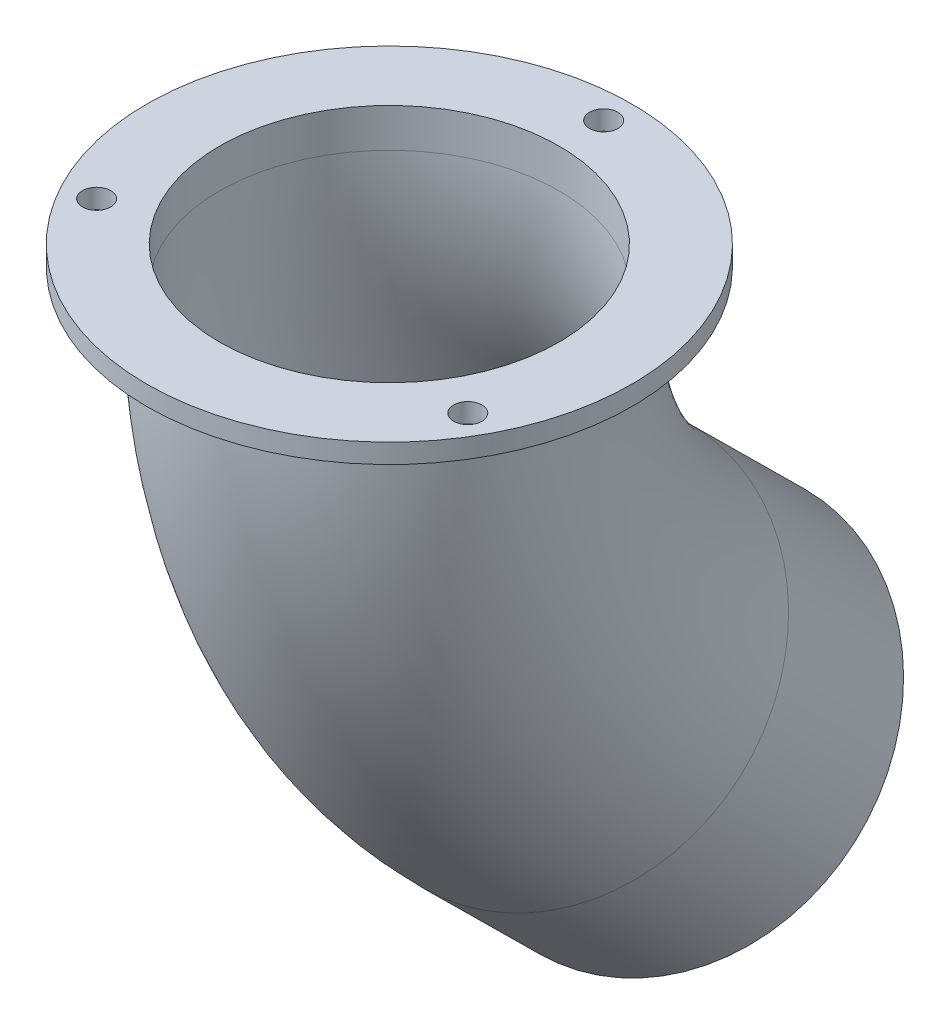
ISO-10303-21;
HEADER;
FILE_DESCRIPTION(('STEP AP214'),'2;1');
FILE_NAME('part.step','',(''),(''),'','','');
FILE_SCHEMA(('AUTOMOTIVE_DESIGN { 1 0 10303 214 1 1 1 1 }'));
ENDSEC;
DATA;
#1=APPLICATION_CONTEXT('core data for automotive mechanical design processes');
#2=APPLICATION_PROTOCOL_DEFINITION('international standard','automotive_design',2000,#1);
#3=PRODUCT_CONTEXT('',#1,'mechanical');
#4=PRODUCT('Part','Part','',(#3));
#5=PRODUCT_RELATED_PRODUCT_CATEGORY('part','',(#4));
#6=PRODUCT_DEFINITION_FORMATION('','',#4);
#7=PRODUCT_DEFINITION_CONTEXT('part definition',#1,'design');
#8=PRODUCT_DEFINITION('design','',#6,#7);
#9=PRODUCT_DEFINITION_SHAPE('','',#8);
#10=(LENGTH_UNIT() NAMED_UNIT(*) SI_UNIT(.MILLI.,.METRE.));
#11=(NAMED_UNIT(*) PLANE_ANGLE_UNIT() SI_UNIT($,.RADIAN.));
#12=(NAMED_UNIT(*) SI_UNIT($,.STERADIAN.) SOLID_ANGLE_UNIT());
#13=UNCERTAINTY_MEASURE_WITH_UNIT(LENGTH_MEASURE(1.E-05),#10,'distance_accuracy_value','');
#14=(GEOMETRIC_REPRESENTATION_CONTEXT(3) GLOBAL_UNCERTAINTY_ASSIGNED_CONTEXT((#13)) GLOBAL_UNIT_ASSIGNED_CONTEXT((#10,
#11,#12)) REPRESENTATION_CONTEXT('',''));
#15=CARTESIAN_POINT('',(0.,0.,0.));
#16=DIRECTION('',(0.,0.,1.));
#17=DIRECTION('',(1.,0.,0.));
#18=AXIS2_PLACEMENT_3D('',#15,#16,#17);
#19=CARTESIAN_POINT('',(0.,-52.1551744018365,-20.7615737432355));
#20=DIRECTION('',(0.,-0.70340608938235,-0.710788205740521));
#21=DIRECTION('',(0.,0.710788205740521,-0.70340608938235));
#22=AXIS2_PLACEMENT_3D('',#19,#20,#21);
#23=CYLINDRICAL_SURFACE('',#22,23.4);
#24=CARTESIAN_POINT('',(0.,-52.1551744018365,-20.7615737432355));
#25=DIRECTION('',(0.,0.703406089382349,0.710788205740522));
#26=DIRECTION('',(0.,-0.710788205740522,0.703406089382349));
#27=AXIS2_PLACEMENT_3D('',#24,#25,#26);
#28=CIRCLE('',#27,23.4);
#29=CARTESIAN_POINT('',(0.,-68.7876184161647,-4.30187125168854));
#30=VERTEX_POINT('',#29);
#31=EDGE_CURVE('E40',#30,#30,#28,.T.);
#32=ORIENTED_EDGE('',*,*,#31,.F.);
#33=EDGE_LOOP('',(#32));
#34=FACE_BOUND('',#33,.T.);
#35=CARTESIAN_POINT('',(0.,-66.2232961894835,-34.9773378580459));
#36=DIRECTION('',(0.,0.703406089382349,0.710788205740522));
#37=DIRECTION('',(0.,-0.710788205740522,0.703406089382349));
#38=AXIS2_PLACEMENT_3D('',#35,#36,#37);
#39=CIRCLE('',#38,23.4);
#40=CARTESIAN_POINT('',(0.,-82.8557402038117,-18.517635366499));
#41=VERTEX_POINT('',#40);
#42=EDGE_CURVE('E10',#41,#41,#39,.T.);
#43=ORIENTED_EDGE('',*,*,#42,.T.);
#44=EDGE_LOOP('',(#43));
#45=FACE_BOUND('',#44,.T.);
#46=ADVANCED_FACE('F30',(#34,#45),#23,.T.);
#47=CARTESIAN_POINT('',(0.,-52.1551744018365,-20.7615737432355));
#48=DIRECTION('',(0.,-0.70340608938235,-0.710788205740521));
#49=DIRECTION('',(0.,0.710788205740521,-0.70340608938235));
#50=AXIS2_PLACEMENT_3D('',#47,#48,#49);
#51=CYLINDRICAL_SURFACE('',#50,21.);
#52=CARTESIAN_POINT('',(0.,-52.1551744018365,-20.7615737432355));
#53=DIRECTION('',(0.,0.703406089382349,0.710788205740522));
#54=DIRECTION('',(0.,-0.710788205740522,0.703406089382349));
#55=AXIS2_PLACEMENT_3D('',#52,#53,#54);
#56=CIRCLE('',#55,21.);
#57=CARTESIAN_POINT('',(0.,-67.0817267223875,-5.99004586620619));
#58=VERTEX_POINT('',#57);
#59=EDGE_CURVE('E44',#58,#58,#56,.T.);
#60=ORIENTED_EDGE('',*,*,#59,.T.);
#61=EDGE_LOOP('',(#60));
#62=FACE_BOUND('',#61,.T.);
#63=CARTESIAN_POINT('',(0.,-66.2232961894835,-34.9773378580459));
#64=DIRECTION('',(0.,0.703406089382349,0.710788205740522));
#65=DIRECTION('',(0.,-0.710788205740522,0.703406089382349));
#66=AXIS2_PLACEMENT_3D('',#63,#64,#65);
#67=CIRCLE('',#66,21.);
#68=CARTESIAN_POINT('',(0.,-81.1498485100344,-20.2058099810166));
#69=VERTEX_POINT('',#68);
#70=EDGE_CURVE('E36',#69,#69,#67,.T.);
#71=ORIENTED_EDGE('',*,*,#70,.F.);
#72=EDGE_LOOP('',(#71));
#73=FACE_BOUND('',#72,.T.);
#74=ADVANCED_FACE('F108',(#62,#73),#51,.F.);
#75=CARTESIAN_POINT('',(0.,-2.4,-70.));
#76=DIRECTION('',(1.,0.,0.));
#77=DIRECTION('',(0.,0.,-1.));
#78=AXIS2_PLACEMENT_3D('',#75,#76,#77);
#79=TOROIDAL_SURFACE('',#78,70.,23.4);
#80=CARTESIAN_POINT('',(0.,-2.4,0.));
#81=DIRECTION('',(0.,1.,0.));
#82=DIRECTION('',(0.,0.,1.));
#83=AXIS2_PLACEMENT_3D('',#80,#81,#82);
#84=CIRCLE('',#83,23.4);
#85=CARTESIAN_POINT('',(0.,-2.4,23.4));
#86=VERTEX_POINT('',#85);
#87=EDGE_CURVE('E49',#86,#86,#84,.T.);
#88=CARTESIAN_POINT('',(0.,-2.4,-70.));
#89=DIRECTION('',(1.,0.,0.));
#90=DIRECTION('',(0.,0.,-1.));
#91=AXIS2_PLACEMENT_3D('',#88,#89,#90);
#92=CIRCLE('',#91,93.4);
#93=EDGE_CURVE('',#86,#30,#92,.T.);
#94=ORIENTED_EDGE('',*,*,#87,.F.);
#95=ORIENTED_EDGE('',*,*,#31,.T.);
#96=ORIENTED_EDGE('',*,*,#93,.T.);
#97=ORIENTED_EDGE('',*,*,#93,.F.);
#98=EDGE_LOOP('',(#94,#96,#95,#97));
#99=FACE_BOUND('',#98,.T.);
#100=ADVANCED_FACE('F113',(#99),#79,.T.);
#101=CARTESIAN_POINT('',(0.,-2.4,-70.));
#102=DIRECTION('',(1.,0.,0.));
#103=DIRECTION('',(0.,0.,-1.));
#104=AXIS2_PLACEMENT_3D('',#101,#102,#103);
#105=TOROIDAL_SURFACE('',#104,70.,21.);
#106=CARTESIAN_POINT('',(0.,-2.4,0.));
#107=DIRECTION('',(0.,1.,0.));
#108=DIRECTION('',(0.,0.,1.));
#109=AXIS2_PLACEMENT_3D('',#106,#107,#108);
#110=CIRCLE('',#109,21.);
#111=CARTESIAN_POINT('',(0.,-2.4,21.));
#112=VERTEX_POINT('',#111);
#113=EDGE_CURVE('E53',#112,#112,#110,.T.);
#114=CARTESIAN_POINT('',(0.,-2.4,-70.));
#115=DIRECTION('',(1.,0.,0.));
#116=DIRECTION('',(0.,0.,-1.));
#117=AXIS2_PLACEMENT_3D('',#114,#115,#116);
#118=CIRCLE('',#117,91.);
#119=EDGE_CURVE('',#112,#58,#118,.T.);
#120=ORIENTED_EDGE('',*,*,#113,.T.);
#121=ORIENTED_EDGE('',*,*,#59,.F.);
#122=ORIENTED_EDGE('',*,*,#119,.T.);
#123=ORIENTED_EDGE('',*,*,#119,.F.);
#124=EDGE_LOOP('',(#120,#122,#121,#123));
#125=FACE_BOUND('',#124,.T.);
#126=ADVANCED_FACE('F118',(#125),#105,.F.);
#127=CARTESIAN_POINT('',(0.,-2.4,0.));
#128=DIRECTION('',(0.,1.,0.));
#129=DIRECTION('',(0.,0.,1.));
#130=AXIS2_PLACEMENT_3D('',#127,#128,#129);
#131=CYLINDRICAL_SURFACE('',#130,21.);
#132=ORIENTED_EDGE('',*,*,#113,.F.);
#133=EDGE_LOOP('',(#132));
#134=FACE_BOUND('',#133,.T.);
#135=CARTESIAN_POINT('',(0.,2.4,0.));
#136=DIRECTION('',(0.,1.,0.));
#137=DIRECTION('',(0.,0.,1.));
#138=AXIS2_PLACEMENT_3D('',#135,#136,#137);
#139=CIRCLE('',#138,21.);
#140=CARTESIAN_POINT('',(0.,2.4,21.));
#141=VERTEX_POINT('',#140);
#142=EDGE_CURVE('E62',#141,#141,#139,.T.);
#143=ORIENTED_EDGE('',*,*,#142,.T.);
#144=EDGE_LOOP('',(#143));
#145=FACE_BOUND('',#144,.T.);
#146=ADVANCED_FACE('F124',(#134,#145),#131,.F.);
#147=CARTESIAN_POINT('',(0.,-2.4,0.));
#148=DIRECTION('',(0.,1.,0.));
#149=DIRECTION('',(0.,0.,1.));
#150=AXIS2_PLACEMENT_3D('',#147,#148,#149);
#151=CYLINDRICAL_SURFACE('',#150,23.4);
#152=ORIENTED_EDGE('',*,*,#87,.T.);
#153=EDGE_LOOP('',(#152));
#154=FACE_BOUND('',#153,.T.);
#155=CARTESIAN_POINT('',(0.,0.,0.));
#156=DIRECTION('',(0.,1.,0.));
#157=DIRECTION('',(0.,0.,1.));
#158=AXIS2_PLACEMENT_3D('',#155,#156,#157);
#159=CIRCLE('',#158,23.4);
#160=CARTESIAN_POINT('',(0.,0.,23.4));
#161=VERTEX_POINT('',#160);
#162=EDGE_CURVE('E50',#161,#161,#159,.T.);
#163=ORIENTED_EDGE('',*,*,#162,.F.);
#164=EDGE_LOOP('',(#163));
#165=FACE_BOUND('',#164,.T.);
#166=ADVANCED_FACE('F102',(#154,#165),#151,.T.);
#167=CARTESIAN_POINT('',(0.,-66.2232961894835,-34.9773378580459));
#168=DIRECTION('',(0.,0.703406089382349,0.710788205740522));
#169=DIRECTION('',(0.,-0.710788205740522,0.703406089382349));
#170=AXIS2_PLACEMENT_3D('',#167,#168,#169);
#171=PLANE('',#170);
#172=ORIENTED_EDGE('',*,*,#70,.T.);
#173=EDGE_LOOP('',(#172));
#174=FACE_BOUND('',#173,.T.);
#175=ORIENTED_EDGE('',*,*,#42,.F.);
#176=EDGE_LOOP('',(#175));
#177=FACE_BOUND('',#176,.T.);
#178=ADVANCED_FACE('F92',(#174,#177),#171,.F.);
#179=CARTESIAN_POINT('',(0.,2.4,0.));
#180=DIRECTION('',(0.,1.,0.));
#181=DIRECTION('',(0.,0.,1.));
#182=AXIS2_PLACEMENT_3D('',#179,#180,#181);
#183=PLANE('',#182);
#184=CARTESIAN_POINT('',(22.9496732002893,2.4,13.249999999999));
#185=DIRECTION('',(0.,1.,0.));
#186=DIRECTION('',(0.,0.,1.));
#187=AXIS2_PLACEMENT_3D('',#184,#185,#186);
#188=CIRCLE('',#187,1.75000000000146);
#189=CARTESIAN_POINT('',(22.9496732002893,2.4,15.0000000000005));
#190=VERTEX_POINT('',#189);
#191=EDGE_CURVE('E71',#190,#190,#188,.T.);
#192=ORIENTED_EDGE('',*,*,#191,.F.);
#193=EDGE_LOOP('',(#192));
#194=FACE_BOUND('',#193,.T.);
#195=ORIENTED_EDGE('',*,*,#142,.F.);
#196=EDGE_LOOP('',(#195));
#197=FACE_BOUND('',#196,.T.);
#198=CARTESIAN_POINT('',(0.,2.4,0.));
#199=DIRECTION('',(0.,1.,0.));
#200=DIRECTION('',(0.,0.,1.));
#201=AXIS2_PLACEMENT_3D('',#198,#199,#200);
#202=CIRCLE('',#201,30.);
#203=CARTESIAN_POINT('',(0.,2.4,30.));
#204=VERTEX_POINT('',#203);
#205=EDGE_CURVE('E54',#204,#204,#202,.T.);
#206=ORIENTED_EDGE('',*,*,#205,.T.);
#207=EDGE_LOOP('',(#206));
#208=FACE_BOUND('',#207,.T.);
#209=CARTESIAN_POINT('',(0.,2.4,-26.5));
#210=DIRECTION('',(0.,1.,0.));
#211=DIRECTION('',(0.,0.,1.));
#212=AXIS2_PLACEMENT_3D('',#209,#210,#211);
#213=CIRCLE('',#212,1.75);
#214=CARTESIAN_POINT('',(0.,2.4,-24.75));
#215=VERTEX_POINT('',#214);
#216=EDGE_CURVE('E67',#215,#215,#213,.T.);
#217=ORIENTED_EDGE('',*,*,#216,.F.);
#218=EDGE_LOOP('',(#217));
#219=FACE_BOUND('',#218,.T.);
#220=CARTESIAN_POINT('',(-22.9496732002859,2.4,13.250000000001));
#221=DIRECTION('',(0.,1.,0.));
#222=DIRECTION('',(0.,0.,1.));
#223=AXIS2_PLACEMENT_3D('',#220,#221,#222);
#224=CIRCLE('',#223,1.75000000000215);
#225=CARTESIAN_POINT('',(-22.9496732002859,2.4,15.0000000000031));
#226=VERTEX_POINT('',#225);
#227=EDGE_CURVE('E77',#226,#226,#224,.T.);
#228=ORIENTED_EDGE('',*,*,#227,.F.);
#229=EDGE_LOOP('',(#228));
#230=FACE_BOUND('',#229,.T.);
#231=ADVANCED_FACE('F89',(#194,#197,#208,#219,#230),#183,.T.);
#232=CARTESIAN_POINT('',(0.,0.,0.));
#233=DIRECTION('',(0.,1.,0.));
#234=DIRECTION('',(0.,0.,1.));
#235=AXIS2_PLACEMENT_3D('',#232,#233,#234);
#236=PLANE('',#235);
#237=ORIENTED_EDGE('',*,*,#162,.T.);
#238=EDGE_LOOP('',(#237));
#239=FACE_BOUND('',#238,.T.);
#240=CARTESIAN_POINT('',(22.9496732002893,0.,13.249999999999));
#241=DIRECTION('',(0.,1.,0.));
#242=DIRECTION('',(0.,0.,1.));
#243=AXIS2_PLACEMENT_3D('',#240,#241,#242);
#244=CIRCLE('',#243,1.75000000000146);
#245=CARTESIAN_POINT('',(22.9496732002893,0.,15.0000000000005));
#246=VERTEX_POINT('',#245);
#247=EDGE_CURVE('E74',#246,#246,#244,.T.);
#248=ORIENTED_EDGE('',*,*,#247,.T.);
#249=EDGE_LOOP('',(#248));
#250=FACE_BOUND('',#249,.T.);
#251=CARTESIAN_POINT('',(0.,0.,0.));
#252=DIRECTION('',(0.,1.,0.));
#253=DIRECTION('',(0.,0.,1.));
#254=AXIS2_PLACEMENT_3D('',#251,#252,#253);
#255=CIRCLE('',#254,30.);
#256=CARTESIAN_POINT('',(0.,0.,30.));
#257=VERTEX_POINT('',#256);
#258=EDGE_CURVE('E59',#257,#257,#255,.T.);
#259=ORIENTED_EDGE('',*,*,#258,.F.);
#260=EDGE_LOOP('',(#259));
#261=FACE_BOUND('',#260,.T.);
#262=CARTESIAN_POINT('',(0.,0.,-26.5));
#263=DIRECTION('',(0.,1.,0.));
#264=DIRECTION('',(0.,0.,1.));
#265=AXIS2_PLACEMENT_3D('',#262,#263,#264);
#266=CIRCLE('',#265,1.75);
#267=CARTESIAN_POINT('',(0.,0.,-24.75));
#268=VERTEX_POINT('',#267);
#269=EDGE_CURVE('E68',#268,#268,#266,.T.);
#270=ORIENTED_EDGE('',*,*,#269,.T.);
#271=EDGE_LOOP('',(#270));
#272=FACE_BOUND('',#271,.T.);
#273=CARTESIAN_POINT('',(-22.9496732002859,0.,13.250000000001));
#274=DIRECTION('',(0.,1.,0.));
#275=DIRECTION('',(0.,0.,1.));
#276=AXIS2_PLACEMENT_3D('',#273,#274,#275);
#277=CIRCLE('',#276,1.75000000000215);
#278=CARTESIAN_POINT('',(-22.9496732002859,0.,15.0000000000031));
#279=VERTEX_POINT('',#278);
#280=EDGE_CURVE('E80',#279,#279,#277,.T.);
#281=ORIENTED_EDGE('',*,*,#280,.T.);
#282=EDGE_LOOP('',(#281));
#283=FACE_BOUND('',#282,.T.);
#284=ADVANCED_FACE('F91',(#239,#250,#261,#272,#283),#236,.F.);
#285=CARTESIAN_POINT('',(0.,2.4,0.));
#286=DIRECTION('',(0.,-1.,0.));
#287=DIRECTION('',(0.,0.,-1.));
#288=AXIS2_PLACEMENT_3D('',#285,#286,#287);
#289=CYLINDRICAL_SURFACE('',#288,30.);
#290=ORIENTED_EDGE('',*,*,#205,.F.);
#291=EDGE_LOOP('',(#290));
#292=FACE_BOUND('',#291,.T.);
#293=ORIENTED_EDGE('',*,*,#258,.T.);
#294=EDGE_LOOP('',(#293));
#295=FACE_BOUND('',#294,.T.);
#296=ADVANCED_FACE('F99',(#292,#295),#289,.T.);
#297=CARTESIAN_POINT('',(0.,2.4,-26.5));
#298=DIRECTION('',(0.,-1.,0.));
#299=DIRECTION('',(0.,0.,-1.));
#300=AXIS2_PLACEMENT_3D('',#297,#298,#299);
#301=CYLINDRICAL_SURFACE('',#300,1.75);
#302=ORIENTED_EDGE('',*,*,#216,.T.);
#303=EDGE_LOOP('',(#302));
#304=FACE_BOUND('',#303,.T.);
#305=ORIENTED_EDGE('',*,*,#269,.F.);
#306=EDGE_LOOP('',(#305));
#307=FACE_BOUND('',#306,.T.);
#308=ADVANCED_FACE('F136',(#304,#307),#301,.F.);
#309=CARTESIAN_POINT('',(22.9496732002893,2.4,13.249999999999));
#310=DIRECTION('',(0.,-1.,0.));
#311=DIRECTION('',(0.,0.,-1.));
#312=AXIS2_PLACEMENT_3D('',#309,#310,#311);
#313=CYLINDRICAL_SURFACE('',#312,1.75000000000146);
#314=ORIENTED_EDGE('',*,*,#191,.T.);
#315=EDGE_LOOP('',(#314));
#316=FACE_BOUND('',#315,.T.);
#317=ORIENTED_EDGE('',*,*,#247,.F.);
#318=EDGE_LOOP('',(#317));
#319=FACE_BOUND('',#318,.T.);
#320=ADVANCED_FACE('F141',(#316,#319),#313,.F.);
#321=CARTESIAN_POINT('',(-22.9496732002859,2.4,13.250000000001));
#322=DIRECTION('',(0.,-1.,0.));
#323=DIRECTION('',(0.,0.,-1.));
#324=AXIS2_PLACEMENT_3D('',#321,#322,#323);
#325=CYLINDRICAL_SURFACE('',#324,1.75000000000215);
#326=ORIENTED_EDGE('',*,*,#227,.T.);
#327=EDGE_LOOP('',(#326));
#328=FACE_BOUND('',#327,.T.);
#329=ORIENTED_EDGE('',*,*,#280,.F.);
#330=EDGE_LOOP('',(#329));
#331=FACE_BOUND('',#330,.T.);
#332=ADVANCED_FACE('F86',(#328,#331),#325,.F.);
#333=CLOSED_SHELL('',(#46,#74,#100,#126,#146,#166,#178,#231,#284,#296,#308,#320,#332));
#334=MANIFOLD_SOLID_BREP('B2',#333);
#335=ADVANCED_BREP_SHAPE_REPRESENTATION('',(#18,#334),#14);
#336=SHAPE_DEFINITION_REPRESENTATION(#9,#335);
ENDSEC;
END-ISO-10303-21;
